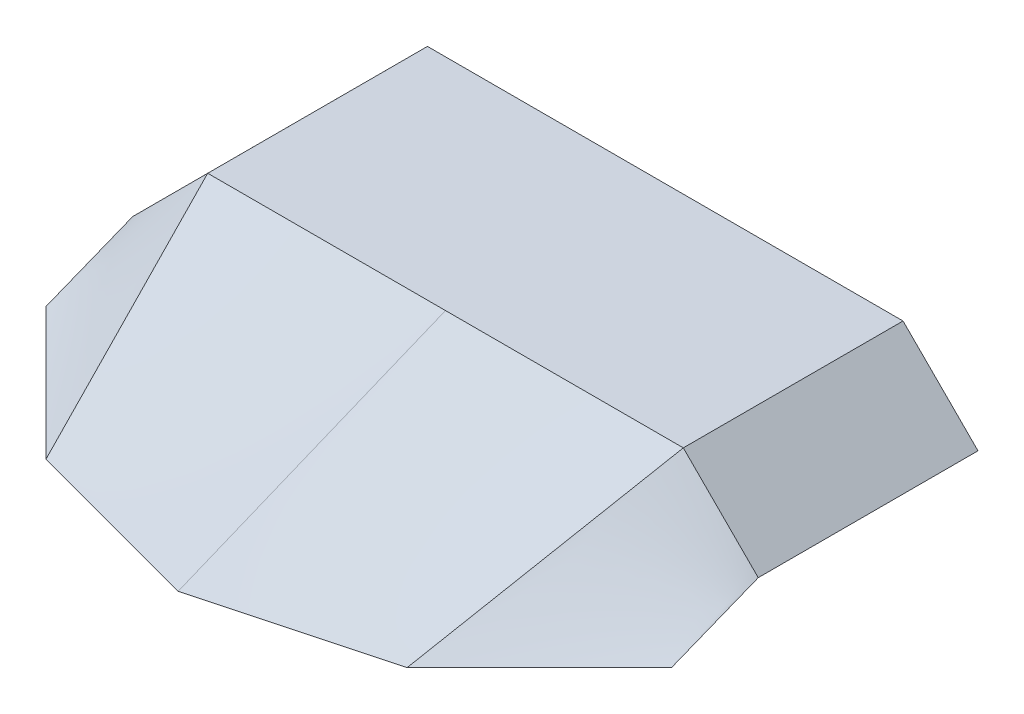
ISO-10303-21;
HEADER;
FILE_DESCRIPTION(('STEP AP214'),'2;1');
FILE_NAME('part.step','',(''),(''),'','','');
FILE_SCHEMA(('AUTOMOTIVE_DESIGN { 1 0 10303 214 1 1 1 1 }'));
ENDSEC;
DATA;
#1=APPLICATION_CONTEXT('core data for automotive mechanical design processes');
#2=APPLICATION_PROTOCOL_DEFINITION('international standard','automotive_design',2000,#1);
#3=PRODUCT_CONTEXT('',#1,'mechanical');
#4=PRODUCT('Part','Part','',(#3));
#5=PRODUCT_RELATED_PRODUCT_CATEGORY('part','',(#4));
#6=PRODUCT_DEFINITION_FORMATION('','',#4);
#7=PRODUCT_DEFINITION_CONTEXT('part definition',#1,'design');
#8=PRODUCT_DEFINITION('design','',#6,#7);
#9=PRODUCT_DEFINITION_SHAPE('','',#8);
#10=(LENGTH_UNIT() NAMED_UNIT(*) SI_UNIT(.MILLI.,.METRE.));
#11=(NAMED_UNIT(*) PLANE_ANGLE_UNIT() SI_UNIT($,.RADIAN.));
#12=(NAMED_UNIT(*) SI_UNIT($,.STERADIAN.) SOLID_ANGLE_UNIT());
#13=UNCERTAINTY_MEASURE_WITH_UNIT(LENGTH_MEASURE(1.E-05),#10,'distance_accuracy_value','');
#14=(GEOMETRIC_REPRESENTATION_CONTEXT(3) GLOBAL_UNCERTAINTY_ASSIGNED_CONTEXT((#13)) GLOBAL_UNIT_ASSIGNED_CONTEXT((#10,
#11,#12)) REPRESENTATION_CONTEXT('',''));
#15=CARTESIAN_POINT('',(0.,0.,0.));
#16=DIRECTION('',(0.,0.,1.));
#17=DIRECTION('',(1.,0.,0.));
#18=AXIS2_PLACEMENT_3D('',#15,#16,#17);
#19=CARTESIAN_POINT('',(0.,0.,0.));
#20=DIRECTION('',(0.,1.,0.));
#21=DIRECTION('',(0.,0.,1.));
#22=AXIS2_PLACEMENT_3D('',#19,#20,#21);
#23=PLANE('',#22);
#24=DIRECTION('',(-0.707106781186552,0.,-0.707106781186543));
#25=VECTOR('',#24,1.);
#26=CARTESIAN_POINT('',(-92.9289321881361,0.,57.7350269193977));
#27=LINE('',#26,#25);
#28=CARTESIAN_POINT('',(-55.1468364680966,0.,95.5171226394368));
#29=VERTEX_POINT('',#28);
#30=CARTESIAN_POINT('',(-92.9289321881361,0.,57.7350269193977));
#31=VERTEX_POINT('',#30);
#32=EDGE_CURVE('E640',#29,#31,#27,.T.);
#33=ORIENTED_EDGE('',*,*,#32,.F.);
#34=DIRECTION('',(-0.965925826289076,0.,-0.258819045102493));
#35=VECTOR('',#34,1.);
#36=CARTESIAN_POINT('',(-55.1468364680966,0.,95.5171226394368));
#37=LINE('',#36,#35);
#38=CARTESIAN_POINT('',(1.97758476261356E-12,0.,110.293672936193));
#39=VERTEX_POINT('',#38);
#40=EDGE_CURVE('E379',#39,#29,#37,.T.);
#41=ORIENTED_EDGE('',*,*,#40,.F.);
#42=DIRECTION('',(-0.96592582628907,0.,0.258819045102516));
#43=VECTOR('',#42,1.);
#44=CARTESIAN_POINT('',(1.9665535620956E-12,0.,110.293672936193));
#45=LINE('',#44,#43);
#46=CARTESIAN_POINT('',(55.1468364680977,0.,95.5171226394361));
#47=VERTEX_POINT('',#46);
#48=EDGE_CURVE('E685',#47,#39,#45,.T.);
#49=ORIENTED_EDGE('',*,*,#48,.F.);
#50=DIRECTION('',(-0.707106781186543,0.,0.707106781186552));
#51=VECTOR('',#50,1.);
#52=CARTESIAN_POINT('',(55.1468364680977,0.,95.5171226394361));
#53=LINE('',#52,#51);
#54=CARTESIAN_POINT('',(92.9289321881356,0.,57.7350269193977));
#55=VERTEX_POINT('',#54);
#56=EDGE_CURVE('E676',#55,#47,#53,.T.);
#57=ORIENTED_EDGE('',*,*,#56,.F.);
#58=DIRECTION('',(-1.,0.,0.));
#59=VECTOR('',#58,1.);
#60=CARTESIAN_POINT('',(92.9289321881356,0.,57.7350269193977));
#61=LINE('',#60,#59);
#62=CARTESIAN_POINT('',(100.000000000001,0.,57.7350269193977));
#63=VERTEX_POINT('',#62);
#64=EDGE_CURVE('E529',#63,#55,#61,.T.);
#65=ORIENTED_EDGE('',*,*,#64,.F.);
#66=DIRECTION('',(0.707106781186539,0.,-0.707106781186555));
#67=VECTOR('',#66,1.);
#68=CARTESIAN_POINT('',(57.7350269191229,0.,100.000000000276));
#69=LINE('',#68,#67);
#70=CARTESIAN_POINT('',(57.7350269191229,0.,100.000000000276));
#71=VERTEX_POINT('',#70);
#72=EDGE_CURVE('E543',#71,#63,#69,.T.);
#73=ORIENTED_EDGE('',*,*,#72,.F.);
#74=DIRECTION('',(0.96592582628907,0.,-0.258819045102516));
#75=VECTOR('',#74,1.);
#76=CARTESIAN_POINT('',(1.96591963826531E-12,0.,115.470053838244));
#77=LINE('',#76,#75);
#78=CARTESIAN_POINT('',(1.96591963826531E-12,0.,115.470053838244));
#79=VERTEX_POINT('',#78);
#80=EDGE_CURVE('E644',#79,#71,#77,.T.);
#81=ORIENTED_EDGE('',*,*,#80,.F.);
#82=DIRECTION('',(0.965925826289075,0.,0.258819045102494));
#83=VECTOR('',#82,1.);
#84=CARTESIAN_POINT('',(-57.7350269191218,0.,100.000000000277));
#85=LINE('',#84,#83);
#86=CARTESIAN_POINT('',(-57.7350269191218,0.,100.000000000277));
#87=VERTEX_POINT('',#86);
#88=EDGE_CURVE('E638',#87,#79,#85,.T.);
#89=ORIENTED_EDGE('',*,*,#88,.F.);
#90=DIRECTION('',(0.707106781186533,0.,0.707106781186562));
#91=VECTOR('',#90,1.);
#92=CARTESIAN_POINT('',(-99.9999999999994,0.,57.7350269193977));
#93=LINE('',#92,#91);
#94=CARTESIAN_POINT('',(-99.9999999999994,0.,57.7350269193977));
#95=VERTEX_POINT('',#94);
#96=EDGE_CURVE('E69',#95,#87,#93,.T.);
#97=ORIENTED_EDGE('',*,*,#96,.F.);
#98=DIRECTION('',(-1.,0.,0.));
#99=VECTOR('',#98,1.);
#100=CARTESIAN_POINT('',(-99.9999999999994,0.,57.7350269193977));
#101=LINE('',#100,#99);
#102=EDGE_CURVE('E12',#31,#95,#101,.T.);
#103=ORIENTED_EDGE('',*,*,#102,.F.);
#104=EDGE_LOOP('',(#33,#41,#49,#57,#65,#73,#81,#89,#97,#103));
#105=FACE_BOUND('',#104,.T.);
#106=ADVANCED_FACE('F59',(#105),#23,.F.);
#107=CARTESIAN_POINT('',(-100.000171145687,11.0356047967976,30.));
#108=CARTESIAN_POINT('',(-99.9999999999994,0.,57.7350269193977));
#109=CARTESIAN_POINT('',(-99.1668092880728,10.6904150130092,30.));
#110=CARTESIAN_POINT('',(-98.8214886980222,0.,57.7350269193977));
#111=CARTESIAN_POINT('',(-98.3334474304582,10.3452252292208,30.));
#112=CARTESIAN_POINT('',(-97.642977396045,0.,57.7350269193977));
#113=CARTESIAN_POINT('',(-96.6667237152291,9.65484566164407,30.));
#114=CARTESIAN_POINT('',(-95.2859547920905,0.,57.7350269193977));
#115=CARTESIAN_POINT('',(-95.8333618576145,9.3096558778557,30.));
#116=CARTESIAN_POINT('',(-94.1074434901133,0.,57.7350269193977));
#117=CARTESIAN_POINT('',(-95.,8.96446609406733,30.));
#118=CARTESIAN_POINT('',(-92.9289321881361,0.,57.7350269193977));
#119=B_SPLINE_SURFACE_WITH_KNOTS('',3,1,((#107,#108),(#109,#110),(#111,#112),(#113,#114),(#115,
#116),(#117,#118)),.UNSPECIFIED.,.F.,.F.,.F.,(4,2,4),(2,2),(0.,0.5,1.),(0.,1.),.UNSPECIFIED.);
#120=DIRECTION('',(0.923879532511289,-0.382683432365085,0.));
#121=VECTOR('',#120,1.);
#122=CARTESIAN_POINT('',(-100.000171145687,11.0356047967976,30.));
#123=LINE('',#122,#121);
#124=CARTESIAN_POINT('',(-100.000171145687,11.0356047967976,30.));
#125=VERTEX_POINT('',#124);
#126=CARTESIAN_POINT('',(-95.,8.96446609406733,30.));
#127=VERTEX_POINT('',#126);
#128=EDGE_CURVE('E223',#125,#127,#123,.T.);
#129=DIRECTION('',(0.0708753495141926,-0.306778785313339,0.949138273231521));
#130=VECTOR('',#129,1.);
#131=CARTESIAN_POINT('',(-93.9644660940681,4.48223304703366,43.8675134596989));
#132=LINE('',#131,#130);
#133=EDGE_CURVE('E383',#127,#31,#132,.T.);
#134=DIRECTION('',(-5.73354386081771E-06,0.369703291265402,-0.929149867564246));
#135=VECTOR('',#134,1.);
#136=CARTESIAN_POINT('',(-100.000085572843,5.51780239839881,43.8675134596989));
#137=LINE('',#136,#135);
#138=EDGE_CURVE('E84',#95,#125,#137,.T.);
#139=ORIENTED_EDGE('',*,*,#128,.T.);
#140=ORIENTED_EDGE('',*,*,#133,.T.);
#141=ORIENTED_EDGE('',*,*,#102,.T.);
#142=ORIENTED_EDGE('',*,*,#138,.T.);
#143=EDGE_LOOP('',(#139,#140,#141,#142));
#144=FACE_BOUND('',#143,.T.);
#145=ADVANCED_FACE('F406',(#144),#119,.T.);
#146=CARTESIAN_POINT('',(-95.,8.96446609406733,30.));
#147=CARTESIAN_POINT('',(-92.9289321881361,0.,57.7350269193977));
#148=CARTESIAN_POINT('',(-94.5902234493444,9.37420786321731,30.));
#149=CARTESIAN_POINT('',(-86.6319162347962,0.,64.0320428727376));
#150=CARTESIAN_POINT('',(-94.1804468986889,9.78394963236728,30.));
#151=CARTESIAN_POINT('',(-80.3349002814563,0.,70.3290588260774));
#152=CARTESIAN_POINT('',(-93.3608937973777,10.6034331706672,30.));
#153=CARTESIAN_POINT('',(-67.7408683747764,0.,82.9230907327571));
#154=CARTESIAN_POINT('',(-92.9511172467222,11.0131749398172,30.));
#155=CARTESIAN_POINT('',(-61.4438524214365,0.,89.220106686097));
#156=CARTESIAN_POINT('',(-92.5413406960666,11.4229167089671,30.));
#157=CARTESIAN_POINT('',(-55.1468364680966,0.,95.5171226394368));
#158=B_SPLINE_SURFACE_WITH_KNOTS('',3,1,((#146,#147),(#148,#149),(#150,#151),(#152,#153),(#154,
#155),(#156,#157)),.UNSPECIFIED.,.F.,.F.,.F.,(4,2,4),(2,2),(0.,0.5,1.),(0.,1.),.UNSPECIFIED.);
#159=DIRECTION('',(0.707136791152087,0.707076769947316,0.));
#160=VECTOR('',#159,1.);
#161=CARTESIAN_POINT('',(-73.9626804632254,30.,30.));
#162=LINE('',#161,#160);
#163=CARTESIAN_POINT('',(-92.5413406960666,11.4229167089672,30.));
#164=VERTEX_POINT('',#163);
#165=EDGE_CURVE('E212',#127,#164,#162,.T.);
#166=DIRECTION('',(0.490113702120252,-0.149715261983755,0.858704780074687));
#167=VECTOR('',#166,1.);
#168=CARTESIAN_POINT('',(-73.8440885820816,5.71145835448357,62.7585613197184));
#169=LINE('',#168,#167);
#170=EDGE_CURVE('E376',#164,#29,#169,.T.);
#171=ORIENTED_EDGE('',*,*,#165,.T.);
#172=ORIENTED_EDGE('',*,*,#170,.T.);
#173=ORIENTED_EDGE('',*,*,#32,.T.);
#174=ORIENTED_EDGE('',*,*,#133,.F.);
#175=EDGE_LOOP('',(#171,#172,#173,#174));
#176=FACE_BOUND('',#175,.T.);
#177=ADVANCED_FACE('F386',(#176),#158,.T.);
#178=CARTESIAN_POINT('',(-76.0343678817123,34.9993738625763,30.));
#179=CARTESIAN_POINT('',(-57.7350269191218,0.,100.000000000277));
#180=CARTESIAN_POINT('',(-80.0286684257082,31.0054123516131,30.));
#181=CARTESIAN_POINT('',(-64.779189099268,0.,92.9558378201305));
#182=CARTESIAN_POINT('',(-84.0229689697041,27.0114508406499,30.));
#183=CARTESIAN_POINT('',(-71.8233512794143,0.,85.911675639984));
#184=CARTESIAN_POINT('',(-92.0115700576958,19.0235278187237,30.));
#185=CARTESIAN_POINT('',(-85.9116756397068,0.,71.8233512796908));
#186=CARTESIAN_POINT('',(-96.0058706016916,15.0295663077606,30.));
#187=CARTESIAN_POINT('',(-92.9558378198531,0.,64.7791890995443));
#188=CARTESIAN_POINT('',(-100.000171145687,11.0356047967976,30.));
#189=CARTESIAN_POINT('',(-99.9999999999994,0.,57.7350269193977));
#190=B_SPLINE_SURFACE_WITH_KNOTS('',3,1,((#178,#179),(#180,#181),(#182,#183),(#184,#185),(#186,
#187),(#188,#189)),.UNSPECIFIED.,.F.,.F.,.F.,(4,2,4),(2,2),(0.,0.5,1.),(0.,1.),.UNSPECIFIED.);
#191=DIRECTION('',(-0.707136791152087,-0.707076769947316,0.));
#192=VECTOR('',#191,1.);
#193=CARTESIAN_POINT('',(-100.000171145687,11.0356047967976,30.));
#194=LINE('',#193,#192);
#195=CARTESIAN_POINT('',(-76.0343678817123,34.9993738625763,30.));
#196=VERTEX_POINT('',#195);
#197=EDGE_CURVE('E265',#196,#125,#194,.T.);
#198=DIRECTION('',(0.227680151600919,-0.435461734018674,0.870939048827432));
#199=VECTOR('',#198,1.);
#200=CARTESIAN_POINT('',(-66.884697400417,17.4996869312881,65.0000000001385));
#201=LINE('',#200,#199);
#202=EDGE_CURVE('E599',#196,#87,#201,.T.);
#203=ORIENTED_EDGE('',*,*,#197,.T.);
#204=ORIENTED_EDGE('',*,*,#138,.F.);
#205=ORIENTED_EDGE('',*,*,#96,.T.);
#206=ORIENTED_EDGE('',*,*,#202,.F.);
#207=EDGE_LOOP('',(#203,#204,#205,#206));
#208=FACE_BOUND('',#207,.T.);
#209=ADVANCED_FACE('F405',(#208),#190,.T.);
#210=CARTESIAN_POINT('',(-92.5413406960666,11.4229167089671,30.));
#211=CARTESIAN_POINT('',(-55.1468364680966,0.,95.5171226394368));
#212=CARTESIAN_POINT('',(-89.4448973239264,14.5190972574726,30.));
#213=CARTESIAN_POINT('',(-45.9556970567468,0.,97.9798810222295));
#214=CARTESIAN_POINT('',(-86.3484539517862,17.6152778059781,30.));
#215=CARTESIAN_POINT('',(-36.7645576453971,0.,100.442639405022));
#216=CARTESIAN_POINT('',(-80.1555672075058,23.8076389029891,30.));
#217=CARTESIAN_POINT('',(-18.3822788226976,0.,105.368156170608));
#218=CARTESIAN_POINT('',(-77.0591238353656,26.9038194514945,30.));
#219=CARTESIAN_POINT('',(-9.1911394113478,0.,107.830914553401));
#220=CARTESIAN_POINT('',(-73.9626804632254,30.,30.));
#221=CARTESIAN_POINT('',(1.97758476261356E-12,0.,110.293672936193));
#222=B_SPLINE_SURFACE_WITH_KNOTS('',3,1,((#210,#211),(#212,#213),(#214,#215),(#216,#217),(#218,
#219),(#220,#221)),.UNSPECIFIED.,.F.,.F.,.F.,(4,2,4),(2,2),(0.,0.5,1.),(0.,1.),.UNSPECIFIED.);
#223=CARTESIAN_POINT('',(-73.9626804632254,30.,30.));
#224=VERTEX_POINT('',#223);
#225=EDGE_CURVE('E63',#164,#224,#162,.T.);
#226=DIRECTION('',(0.653296148273218,-0.264983425768901,0.709216417406672));
#227=VECTOR('',#226,1.);
#228=CARTESIAN_POINT('',(-36.9813402316117,15.,70.1468364680966));
#229=LINE('',#228,#227);
#230=EDGE_CURVE('E382',#224,#39,#229,.T.);
#231=ORIENTED_EDGE('',*,*,#225,.T.);
#232=ORIENTED_EDGE('',*,*,#230,.T.);
#233=ORIENTED_EDGE('',*,*,#40,.T.);
#234=ORIENTED_EDGE('',*,*,#170,.F.);
#235=EDGE_LOOP('',(#231,#232,#233,#234));
#236=FACE_BOUND('',#235,.T.);
#237=ADVANCED_FACE('F377',(#236),#222,.T.);
#238=CARTESIAN_POINT('',(-73.9626804632254,30.,30.));
#239=CARTESIAN_POINT('',(1.9665535620956E-12,0.,110.293672936193));
#240=CARTESIAN_POINT('',(-49.3076804632254,30.,30.));
#241=CARTESIAN_POINT('',(9.19113941135125,0.,107.8309145534));
#242=CARTESIAN_POINT('',(-24.6526804632254,30.,30.));
#243=CARTESIAN_POINT('',(18.3822788227005,0.,105.368156170608));
#244=CARTESIAN_POINT('',(24.6573195367746,30.,30.));
#245=CARTESIAN_POINT('',(36.7645576453991,0.,100.442639405022));
#246=CARTESIAN_POINT('',(49.3123195367746,30.,30.));
#247=CARTESIAN_POINT('',(45.9556970567484,0.,97.979881022229));
#248=CARTESIAN_POINT('',(73.9673195367746,30.,30.));
#249=CARTESIAN_POINT('',(55.1468364680977,0.,95.5171226394361));
#250=B_SPLINE_SURFACE_WITH_KNOTS('',3,1,((#238,#239),(#240,#241),(#242,#243),(#244,#245),(#246,
#247),(#248,#249)),.UNSPECIFIED.,.F.,.F.,.F.,(4,2,4),(2,2),(0.,0.5,1.),(0.,1.),.UNSPECIFIED.);
#251=DIRECTION('',(1.,0.,0.));
#252=VECTOR('',#251,1.);
#253=CARTESIAN_POINT('',(73.9673195367746,30.,30.));
#254=LINE('',#253,#252);
#255=CARTESIAN_POINT('',(73.9673195367746,30.,30.));
#256=VERTEX_POINT('',#255);
#257=EDGE_CURVE('E216',#224,#256,#254,.T.);
#258=DIRECTION('',(-0.25270467329089,-0.402813263137972,0.879705532060066));
#259=VECTOR('',#258,1.);
#260=CARTESIAN_POINT('',(64.5570780024361,15.,62.7585613197181));
#261=LINE('',#260,#259);
#262=EDGE_CURVE('E466',#256,#47,#261,.T.);
#263=ORIENTED_EDGE('',*,*,#257,.T.);
#264=ORIENTED_EDGE('',*,*,#262,.T.);
#265=ORIENTED_EDGE('',*,*,#48,.T.);
#266=ORIENTED_EDGE('',*,*,#230,.F.);
#267=EDGE_LOOP('',(#263,#264,#265,#266));
#268=FACE_BOUND('',#267,.T.);
#269=ADVANCED_FACE('F445',(#268),#250,.T.);
#270=CARTESIAN_POINT('',(73.9673195367746,30.,30.));
#271=CARTESIAN_POINT('',(55.1468364680977,0.,95.5171226394361));
#272=CARTESIAN_POINT('',(77.4730930550179,26.4939288892474,30.));
#273=CARTESIAN_POINT('',(61.4438524214374,0.,89.2201066860964));
#274=CARTESIAN_POINT('',(80.9788665732612,22.9878577784949,30.));
#275=CARTESIAN_POINT('',(67.740868374777,0.,82.9230907327566));
#276=CARTESIAN_POINT('',(87.9904136097477,15.9757155569898,30.));
#277=CARTESIAN_POINT('',(80.3349002814563,0.,70.3290588260772));
#278=CARTESIAN_POINT('',(91.4961871279909,12.4696444462373,30.));
#279=CARTESIAN_POINT('',(86.631916234796,0.,64.0320428727374));
#280=CARTESIAN_POINT('',(95.0019606462341,8.96357333548485,30.));
#281=CARTESIAN_POINT('',(92.9289321881356,0.,57.7350269193977));
#282=B_SPLINE_SURFACE_WITH_KNOTS('',3,1,((#270,#271),(#272,#273),(#274,#275),(#276,#277),(#278,
#279),(#280,#281)),.UNSPECIFIED.,.F.,.F.,.F.,(4,2,4),(2,2),(0.,0.5,1.),(0.,1.),.UNSPECIFIED.);
#283=DIRECTION('',(0.707076769947316,-0.707136791152087,0.));
#284=VECTOR('',#283,1.);
#285=CARTESIAN_POINT('',(95.0019606462341,8.96357333548485,30.));
#286=LINE('',#285,#284);
#287=CARTESIAN_POINT('',(95.0019606462341,8.96357333548485,30.));
#288=VERTEX_POINT('',#287);
#289=EDGE_CURVE('E342',#256,#288,#286,.T.);
#290=DIRECTION('',(-0.070942773414323,-0.30674964911252,0.949142652960886));
#291=VECTOR('',#290,1.);
#292=CARTESIAN_POINT('',(93.9654464171849,4.48178666774243,43.8675134596989));
#293=LINE('',#292,#291);
#294=EDGE_CURVE('E482',#288,#55,#293,.T.);
#295=ORIENTED_EDGE('',*,*,#289,.T.);
#296=ORIENTED_EDGE('',*,*,#294,.T.);
#297=ORIENTED_EDGE('',*,*,#56,.T.);
#298=ORIENTED_EDGE('',*,*,#262,.F.);
#299=EDGE_LOOP('',(#295,#296,#297,#298));
#300=FACE_BOUND('',#299,.T.);
#301=ADVANCED_FACE('F493',(#300),#282,.T.);
#302=CARTESIAN_POINT('',(95.0019606462341,8.96357333548485,30.));
#303=CARTESIAN_POINT('',(92.9289321881356,0.,57.7350269193977));
#304=CARTESIAN_POINT('',(95.8349920247153,9.30862623033412,30.));
#305=CARTESIAN_POINT('',(94.1074434901132,0.,57.7350269193977));
#306=CARTESIAN_POINT('',(96.6680234031964,9.65367912518335,30.));
#307=CARTESIAN_POINT('',(95.2859547920907,0.,57.7350269193977));
#308=CARTESIAN_POINT('',(98.3340861601584,10.3437849148817,30.));
#309=CARTESIAN_POINT('',(97.6429773960457,0.,57.7350269193977));
#310=CARTESIAN_POINT('',(99.1671175386393,10.6888378097309,30.));
#311=CARTESIAN_POINT('',(98.8214886980232,0.,57.7350269193977));
#312=CARTESIAN_POINT('',(100.00014891712,11.03389070458,30.));
#313=CARTESIAN_POINT('',(100.000000000001,0.,57.7350269193977));
#314=B_SPLINE_SURFACE_WITH_KNOTS('',3,1,((#302,#303),(#304,#305),(#306,#307),(#308,#309),(#310,
#311),(#312,#313)),.UNSPECIFIED.,.F.,.F.,.F.,(4,2,4),(2,2),(0.,0.5,1.),(0.,1.),.UNSPECIFIED.);
#315=DIRECTION('',(0.923879532511286,0.382683432365091,0.));
#316=VECTOR('',#315,1.);
#317=CARTESIAN_POINT('',(95.0019606462341,8.96357333548485,30.));
#318=LINE('',#317,#316);
#319=CARTESIAN_POINT('',(100.00014891712,11.03389070458,30.));
#320=VERTEX_POINT('',#319);
#321=EDGE_CURVE('E302',#288,#320,#318,.T.);
#322=DIRECTION('',(-4.98897151365473E-06,-0.369653714668058,0.929169592274315));
#323=VECTOR('',#322,1.);
#324=CARTESIAN_POINT('',(100.00007445856,5.51694535229,43.8675134596989));
#325=LINE('',#324,#323);
#326=EDGE_CURVE('E583',#320,#63,#325,.T.);
#327=ORIENTED_EDGE('',*,*,#321,.T.);
#328=ORIENTED_EDGE('',*,*,#326,.T.);
#329=ORIENTED_EDGE('',*,*,#64,.T.);
#330=ORIENTED_EDGE('',*,*,#294,.F.);
#331=EDGE_LOOP('',(#327,#328,#329,#330));
#332=FACE_BOUND('',#331,.T.);
#333=ADVANCED_FACE('F504',(#332),#314,.T.);
#334=CARTESIAN_POINT('',(100.00014891712,11.03389070458,30.));
#335=CARTESIAN_POINT('',(100.000000000001,0.,57.7350269193977));
#336=CARTESIAN_POINT('',(96.0062407526252,15.0281378975793,30.));
#337=CARTESIAN_POINT('',(92.9558378198544,0.,64.7791890995442));
#338=CARTESIAN_POINT('',(92.0123325881303,19.0223850905786,30.));
#339=CARTESIAN_POINT('',(85.9116756397081,0.,71.8233512796906));
#340=CARTESIAN_POINT('',(84.0245162591402,27.0108794765773,30.));
#341=CARTESIAN_POINT('',(71.8233512794155,0.,85.9116756399835));
#342=CARTESIAN_POINT('',(80.0306080946451,31.0051266695768,30.));
#343=CARTESIAN_POINT('',(64.7791890992692,0.,92.9558378201299));
#344=CARTESIAN_POINT('',(76.03669993015,34.9993738625763,30.));
#345=CARTESIAN_POINT('',(57.7350269191229,0.,100.000000000276));
#346=B_SPLINE_SURFACE_WITH_KNOTS('',3,1,((#334,#335),(#336,#337),(#338,#339),(#340,#341),(#342,
#343),(#344,#345)),.UNSPECIFIED.,.F.,.F.,.F.,(4,2,4),(2,2),(0.,0.5,1.),(0.,1.),.UNSPECIFIED.);
#347=DIRECTION('',(-0.707076769947317,0.707136791152086,0.));
#348=VECTOR('',#347,1.);
#349=CARTESIAN_POINT('',(76.03669993015,34.9993738625763,30.));
#350=LINE('',#349,#348);
#351=CARTESIAN_POINT('',(76.03669993015,34.9993738625763,30.));
#352=VERTEX_POINT('',#351);
#353=EDGE_CURVE('E299',#320,#352,#350,.T.);
#354=DIRECTION('',(-0.227707662540062,-0.435458857111651,0.870933294910441));
#355=VECTOR('',#354,1.);
#356=CARTESIAN_POINT('',(66.8858634246364,17.4996869312881,65.0000000001382));
#357=LINE('',#356,#355);
#358=EDGE_CURVE('E575',#352,#71,#357,.T.);
#359=ORIENTED_EDGE('',*,*,#353,.T.);
#360=ORIENTED_EDGE('',*,*,#358,.T.);
#361=ORIENTED_EDGE('',*,*,#72,.T.);
#362=ORIENTED_EDGE('',*,*,#326,.F.);
#363=EDGE_LOOP('',(#359,#360,#361,#362));
#364=FACE_BOUND('',#363,.T.);
#365=ADVANCED_FACE('F548',(#364),#346,.T.);
#366=CARTESIAN_POINT('',(76.0366999301499,34.9993738625763,30.));
#367=CARTESIAN_POINT('',(57.7350269191229,0.,100.000000000276));
#368=CARTESIAN_POINT('',(63.3641109458692,34.9993738625763,30.));
#369=CARTESIAN_POINT('',(48.1125224326027,0.,102.578342306604));
#370=CARTESIAN_POINT('',(50.6915219615886,34.9993738625763,30.));
#371=CARTESIAN_POINT('',(38.4900179460826,0.,105.156684612932));
#372=CARTESIAN_POINT('',(25.3463439930273,34.9993738625763,30.));
#373=CARTESIAN_POINT('',(19.2450089730423,0.,110.313369225588));
#374=CARTESIAN_POINT('',(12.6737550087468,34.9993738625763,30.));
#375=CARTESIAN_POINT('',(9.62250448652211,0.,112.891711531916));
#376=CARTESIAN_POINT('',(0.00116602446624536,34.9993738625763,30.));
#377=CARTESIAN_POINT('',(1.96591963826531E-12,0.,115.470053838244));
#378=B_SPLINE_SURFACE_WITH_KNOTS('',3,1,((#366,#367),(#368,#369),(#370,#371),(#372,#373),(#374,
#375),(#376,#377)),.UNSPECIFIED.,.F.,.F.,.F.,(4,2,4),(2,2),(0.,0.5,1.),(0.,1.),.UNSPECIFIED.);
#379=DIRECTION('',(-1.,0.,0.));
#380=VECTOR('',#379,1.);
#381=CARTESIAN_POINT('',(-76.0343678817123,34.9993738625763,30.));
#382=LINE('',#381,#380);
#383=CARTESIAN_POINT('',(0.0011660244661621,34.9993738625763,30.));
#384=VERTEX_POINT('',#383);
#385=EDGE_CURVE('E169',#352,#384,#382,.T.);
#386=DIRECTION('',(-1.26249873184187E-05,-0.37895144116095,0.925416557601305));
#387=VECTOR('',#386,1.);
#388=CARTESIAN_POINT('',(0.000583012234105641,17.4996869312881,72.7350269191218));
#389=LINE('',#388,#387);
#390=EDGE_CURVE('E582',#384,#79,#389,.T.);
#391=ORIENTED_EDGE('',*,*,#385,.T.);
#392=ORIENTED_EDGE('',*,*,#390,.T.);
#393=ORIENTED_EDGE('',*,*,#80,.T.);
#394=ORIENTED_EDGE('',*,*,#358,.F.);
#395=EDGE_LOOP('',(#391,#392,#393,#394));
#396=FACE_BOUND('',#395,.T.);
#397=ADVANCED_FACE('F559',(#396),#378,.T.);
#398=CARTESIAN_POINT('',(0.00116602446624536,34.9993738625763,30.));
#399=CARTESIAN_POINT('',(1.96370697480575E-12,0.,115.470053838244));
#400=CARTESIAN_POINT('',(-12.6714229598968,34.9993738625763,30.));
#401=CARTESIAN_POINT('',(-9.62250448651869,0.,112.891711531916));
#402=CARTESIAN_POINT('',(-25.3440119442599,34.9993738625763,30.));
#403=CARTESIAN_POINT('',(-19.2450089730393,0.,110.313369225588));
#404=CARTESIAN_POINT('',(-50.6891899129861,34.9993738625763,30.));
#405=CARTESIAN_POINT('',(-38.4900179460806,0.,105.156684612933));
#406=CARTESIAN_POINT('',(-63.3617788973492,34.9993738625763,30.));
#407=CARTESIAN_POINT('',(-48.1125224326012,0.,102.578342306605));
#408=CARTESIAN_POINT('',(-76.0343678817123,34.9993738625763,30.));
#409=CARTESIAN_POINT('',(-57.7350269191218,0.,100.000000000277));
#410=B_SPLINE_SURFACE_WITH_KNOTS('',3,1,((#398,#399),(#400,#401),(#402,#403),(#404,#405),(#406,
#407),(#408,#409)),.UNSPECIFIED.,.F.,.F.,.F.,(4,2,4),(2,2),(0.,0.5,1.),(0.,1.),.UNSPECIFIED.);
#411=EDGE_CURVE('E301',#384,#196,#382,.T.);
#412=ORIENTED_EDGE('',*,*,#411,.T.);
#413=ORIENTED_EDGE('',*,*,#202,.T.);
#414=ORIENTED_EDGE('',*,*,#88,.T.);
#415=ORIENTED_EDGE('',*,*,#390,.F.);
#416=EDGE_LOOP('',(#412,#413,#414,#415));
#417=FACE_BOUND('',#416,.T.);
#418=ADVANCED_FACE('F611',(#417),#410,.T.);
#419=CARTESIAN_POINT('',(76.03669993015,34.9993738625763,-40.26));
#420=DIRECTION('',(0.707136791152086,0.707076769947317,0.));
#421=DIRECTION('',(-0.707076769947317,0.707136791152086,0.));
#422=AXIS2_PLACEMENT_3D('',#419,#420,#421);
#423=PLANE('',#422);
#424=ORIENTED_EDGE('',*,*,#353,.F.);
#425=DIRECTION('',(0.,0.,1.));
#426=VECTOR('',#425,1.);
#427=CARTESIAN_POINT('',(100.00014891712,11.03389070458,-40.26));
#428=LINE('',#427,#426);
#429=CARTESIAN_POINT('',(100.00014891712,11.03389070458,-40.26));
#430=VERTEX_POINT('',#429);
#431=EDGE_CURVE('E190',#430,#320,#428,.T.);
#432=ORIENTED_EDGE('',*,*,#431,.F.);
#433=DIRECTION('',(-0.707076769947317,0.707136791152086,0.));
#434=VECTOR('',#433,1.);
#435=CARTESIAN_POINT('',(76.03669993015,34.9993738625763,-40.26));
#436=LINE('',#435,#434);
#437=CARTESIAN_POINT('',(76.03669993015,34.9993738625763,-40.26));
#438=VERTEX_POINT('',#437);
#439=EDGE_CURVE('E183',#430,#438,#436,.T.);
#440=ORIENTED_EDGE('',*,*,#439,.T.);
#441=DIRECTION('',(0.,0.,1.));
#442=VECTOR('',#441,1.);
#443=CARTESIAN_POINT('',(76.03669993015,34.9993738625763,-40.26));
#444=LINE('',#443,#442);
#445=EDGE_CURVE('E164',#438,#352,#444,.T.);
#446=ORIENTED_EDGE('',*,*,#445,.T.);
#447=EDGE_LOOP('',(#424,#432,#440,#446));
#448=FACE_BOUND('',#447,.T.);
#449=ADVANCED_FACE('F189',(#448),#423,.T.);
#450=CARTESIAN_POINT('',(100.00014891712,11.03389070458,-40.26));
#451=DIRECTION('',(0.382683432365091,-0.923879532511286,0.));
#452=DIRECTION('',(0.923879532511286,0.382683432365091,0.));
#453=AXIS2_PLACEMENT_3D('',#450,#451,#452);
#454=PLANE('',#453);
#455=ORIENTED_EDGE('',*,*,#321,.F.);
#456=DIRECTION('',(0.,0.,1.));
#457=VECTOR('',#456,1.);
#458=CARTESIAN_POINT('',(95.0019606462341,8.96357333548485,-40.26));
#459=LINE('',#458,#457);
#460=CARTESIAN_POINT('',(95.0019606462341,8.96357333548485,-40.26));
#461=VERTEX_POINT('',#460);
#462=EDGE_CURVE('E286',#461,#288,#459,.T.);
#463=ORIENTED_EDGE('',*,*,#462,.F.);
#464=DIRECTION('',(0.923879532511286,0.382683432365091,0.));
#465=VECTOR('',#464,1.);
#466=CARTESIAN_POINT('',(100.00014891712,11.03389070458,-40.26));
#467=LINE('',#466,#465);
#468=EDGE_CURVE('E176',#461,#430,#467,.T.);
#469=ORIENTED_EDGE('',*,*,#468,.T.);
#470=ORIENTED_EDGE('',*,*,#431,.T.);
#471=EDGE_LOOP('',(#455,#463,#469,#470));
#472=FACE_BOUND('',#471,.T.);
#473=ADVANCED_FACE('F310',(#472),#454,.T.);
#474=CARTESIAN_POINT('',(95.0019606462341,8.96357333548485,-40.26));
#475=DIRECTION('',(-0.707136791152087,-0.707076769947316,0.));
#476=DIRECTION('',(0.707076769947316,-0.707136791152087,0.));
#477=AXIS2_PLACEMENT_3D('',#474,#475,#476);
#478=PLANE('',#477);
#479=ORIENTED_EDGE('',*,*,#289,.F.);
#480=DIRECTION('',(0.,0.,1.));
#481=VECTOR('',#480,1.);
#482=CARTESIAN_POINT('',(73.9673195367746,30.,-40.26));
#483=LINE('',#482,#481);
#484=CARTESIAN_POINT('',(73.9673195367746,30.,-40.26));
#485=VERTEX_POINT('',#484);
#486=EDGE_CURVE('E290',#485,#256,#483,.T.);
#487=ORIENTED_EDGE('',*,*,#486,.F.);
#488=DIRECTION('',(0.707076769947316,-0.707136791152087,0.));
#489=VECTOR('',#488,1.);
#490=CARTESIAN_POINT('',(95.0019606462341,8.96357333548485,-40.26));
#491=LINE('',#490,#489);
#492=EDGE_CURVE('E203',#485,#461,#491,.T.);
#493=ORIENTED_EDGE('',*,*,#492,.T.);
#494=ORIENTED_EDGE('',*,*,#462,.T.);
#495=EDGE_LOOP('',(#479,#487,#493,#494));
#496=FACE_BOUND('',#495,.T.);
#497=ADVANCED_FACE('F320',(#496),#478,.T.);
#498=CARTESIAN_POINT('',(73.9673195367746,30.,-40.26));
#499=DIRECTION('',(0.,-1.,0.));
#500=DIRECTION('',(1.,0.,0.));
#501=AXIS2_PLACEMENT_3D('',#498,#499,#500);
#502=PLANE('',#501);
#503=ORIENTED_EDGE('',*,*,#257,.F.);
#504=DIRECTION('',(0.,0.,1.));
#505=VECTOR('',#504,1.);
#506=CARTESIAN_POINT('',(-73.9626804632254,30.,-40.26));
#507=LINE('',#506,#505);
#508=CARTESIAN_POINT('',(-73.9626804632254,30.,-40.26));
#509=VERTEX_POINT('',#508);
#510=EDGE_CURVE('E339',#509,#224,#507,.T.);
#511=ORIENTED_EDGE('',*,*,#510,.F.);
#512=DIRECTION('',(1.,0.,0.));
#513=VECTOR('',#512,1.);
#514=CARTESIAN_POINT('',(73.9673195367746,30.,-40.26));
#515=LINE('',#514,#513);
#516=EDGE_CURVE('E200',#509,#485,#515,.T.);
#517=ORIENTED_EDGE('',*,*,#516,.T.);
#518=ORIENTED_EDGE('',*,*,#486,.T.);
#519=EDGE_LOOP('',(#503,#511,#517,#518));
#520=FACE_BOUND('',#519,.T.);
#521=ADVANCED_FACE('F323',(#520),#502,.T.);
#522=CARTESIAN_POINT('',(-73.9626804632254,30.,-40.26));
#523=DIRECTION('',(0.707076769947316,-0.707136791152087,0.));
#524=DIRECTION('',(0.707136791152087,0.707076769947316,0.));
#525=AXIS2_PLACEMENT_3D('',#522,#523,#524);
#526=PLANE('',#525);
#527=ORIENTED_EDGE('',*,*,#165,.F.);
#528=DIRECTION('',(0.,0.,1.));
#529=VECTOR('',#528,1.);
#530=CARTESIAN_POINT('',(-95.,8.96446609406733,-40.26));
#531=LINE('',#530,#529);
#532=CARTESIAN_POINT('',(-95.,8.96446609406733,-40.26));
#533=VERTEX_POINT('',#532);
#534=EDGE_CURVE('E714',#533,#127,#531,.T.);
#535=ORIENTED_EDGE('',*,*,#534,.F.);
#536=DIRECTION('',(0.707136791152087,0.707076769947316,0.));
#537=VECTOR('',#536,1.);
#538=CARTESIAN_POINT('',(-73.9626804632254,30.,-40.26));
#539=LINE('',#538,#537);
#540=EDGE_CURVE('E197',#533,#509,#539,.T.);
#541=ORIENTED_EDGE('',*,*,#540,.T.);
#542=ORIENTED_EDGE('',*,*,#510,.T.);
#543=ORIENTED_EDGE('',*,*,#225,.F.);
#544=EDGE_LOOP('',(#527,#535,#541,#542,#543));
#545=FACE_BOUND('',#544,.T.);
#546=ADVANCED_FACE('F241',(#545),#526,.T.);
#547=CARTESIAN_POINT('',(-95.,8.96446609406733,-40.26));
#548=DIRECTION('',(-0.382683432365085,-0.923879532511289,0.));
#549=DIRECTION('',(0.923879532511289,-0.382683432365085,0.));
#550=AXIS2_PLACEMENT_3D('',#547,#548,#549);
#551=PLANE('',#550);
#552=ORIENTED_EDGE('',*,*,#128,.F.);
#553=DIRECTION('',(0.,0.,1.));
#554=VECTOR('',#553,1.);
#555=CARTESIAN_POINT('',(-100.000171145687,11.0356047967976,-40.26));
#556=LINE('',#555,#554);
#557=CARTESIAN_POINT('',(-100.000171145687,11.0356047967976,-40.26));
#558=VERTEX_POINT('',#557);
#559=EDGE_CURVE('E228',#558,#125,#556,.T.);
#560=ORIENTED_EDGE('',*,*,#559,.F.);
#561=DIRECTION('',(0.923879532511289,-0.382683432365085,0.));
#562=VECTOR('',#561,1.);
#563=CARTESIAN_POINT('',(-95.,8.96446609406733,-40.26));
#564=LINE('',#563,#562);
#565=EDGE_CURVE('E194',#558,#533,#564,.T.);
#566=ORIENTED_EDGE('',*,*,#565,.T.);
#567=ORIENTED_EDGE('',*,*,#534,.T.);
#568=EDGE_LOOP('',(#552,#560,#566,#567));
#569=FACE_BOUND('',#568,.T.);
#570=ADVANCED_FACE('F230',(#569),#551,.T.);
#571=CARTESIAN_POINT('',(-100.000171145687,11.0356047967976,-40.26));
#572=DIRECTION('',(-0.707076769947316,0.707136791152087,0.));
#573=DIRECTION('',(-0.707136791152087,-0.707076769947316,0.));
#574=AXIS2_PLACEMENT_3D('',#571,#572,#573);
#575=PLANE('',#574);
#576=ORIENTED_EDGE('',*,*,#197,.F.);
#577=DIRECTION('',(0.,0.,1.));
#578=VECTOR('',#577,1.);
#579=CARTESIAN_POINT('',(-76.0343678817123,34.9993738625763,-40.26));
#580=LINE('',#579,#578);
#581=CARTESIAN_POINT('',(-76.0343678817123,34.9993738625763,-40.26));
#582=VERTEX_POINT('',#581);
#583=EDGE_CURVE('E175',#582,#196,#580,.T.);
#584=ORIENTED_EDGE('',*,*,#583,.F.);
#585=DIRECTION('',(-0.707136791152087,-0.707076769947316,0.));
#586=VECTOR('',#585,1.);
#587=CARTESIAN_POINT('',(-100.000171145687,11.0356047967976,-40.26));
#588=LINE('',#587,#586);
#589=EDGE_CURVE('E187',#582,#558,#588,.T.);
#590=ORIENTED_EDGE('',*,*,#589,.T.);
#591=ORIENTED_EDGE('',*,*,#559,.T.);
#592=EDGE_LOOP('',(#576,#584,#590,#591));
#593=FACE_BOUND('',#592,.T.);
#594=ADVANCED_FACE('F240',(#593),#575,.T.);
#595=CARTESIAN_POINT('',(-76.0343678817123,34.9993738625763,-40.26));
#596=DIRECTION('',(0.,1.,0.));
#597=DIRECTION('',(0.,0.,1.));
#598=AXIS2_PLACEMENT_3D('',#595,#596,#597);
#599=PLANE('',#598);
#600=ORIENTED_EDGE('',*,*,#385,.F.);
#601=ORIENTED_EDGE('',*,*,#445,.F.);
#602=DIRECTION('',(-1.,0.,0.));
#603=VECTOR('',#602,1.);
#604=CARTESIAN_POINT('',(-76.0343678817123,34.9993738625763,-40.26));
#605=LINE('',#604,#603);
#606=EDGE_CURVE('E167',#438,#582,#605,.T.);
#607=ORIENTED_EDGE('',*,*,#606,.T.);
#608=ORIENTED_EDGE('',*,*,#583,.T.);
#609=ORIENTED_EDGE('',*,*,#411,.F.);
#610=EDGE_LOOP('',(#600,#601,#607,#608,#609));
#611=FACE_BOUND('',#610,.T.);
#612=ADVANCED_FACE('F166',(#611),#599,.T.);
#613=CARTESIAN_POINT('',(0.,0.,-40.26));
#614=DIRECTION('',(0.,0.,-1.));
#615=DIRECTION('',(-1.,0.,0.));
#616=AXIS2_PLACEMENT_3D('',#613,#614,#615);
#617=PLANE('',#616);
#618=ORIENTED_EDGE('',*,*,#439,.F.);
#619=ORIENTED_EDGE('',*,*,#468,.F.);
#620=ORIENTED_EDGE('',*,*,#492,.F.);
#621=ORIENTED_EDGE('',*,*,#516,.F.);
#622=ORIENTED_EDGE('',*,*,#540,.F.);
#623=ORIENTED_EDGE('',*,*,#565,.F.);
#624=ORIENTED_EDGE('',*,*,#589,.F.);
#625=ORIENTED_EDGE('',*,*,#606,.F.);
#626=EDGE_LOOP('',(#618,#619,#620,#621,#622,#623,#624,#625));
#627=FACE_BOUND('',#626,.T.);
#628=ADVANCED_FACE('F181',(#627),#617,.T.);
#629=CLOSED_SHELL('',(#106,#145,#177,#209,#237,#269,#301,#333,#365,#397,#418,#449,#473,#497,
#521,#546,#570,#594,#612,#628));
#630=MANIFOLD_SOLID_BREP('B2',#629);
#631=ADVANCED_BREP_SHAPE_REPRESENTATION('',(#18,#630),#14);
#632=SHAPE_DEFINITION_REPRESENTATION(#9,#631);
ENDSEC;
END-ISO-10303-21;
